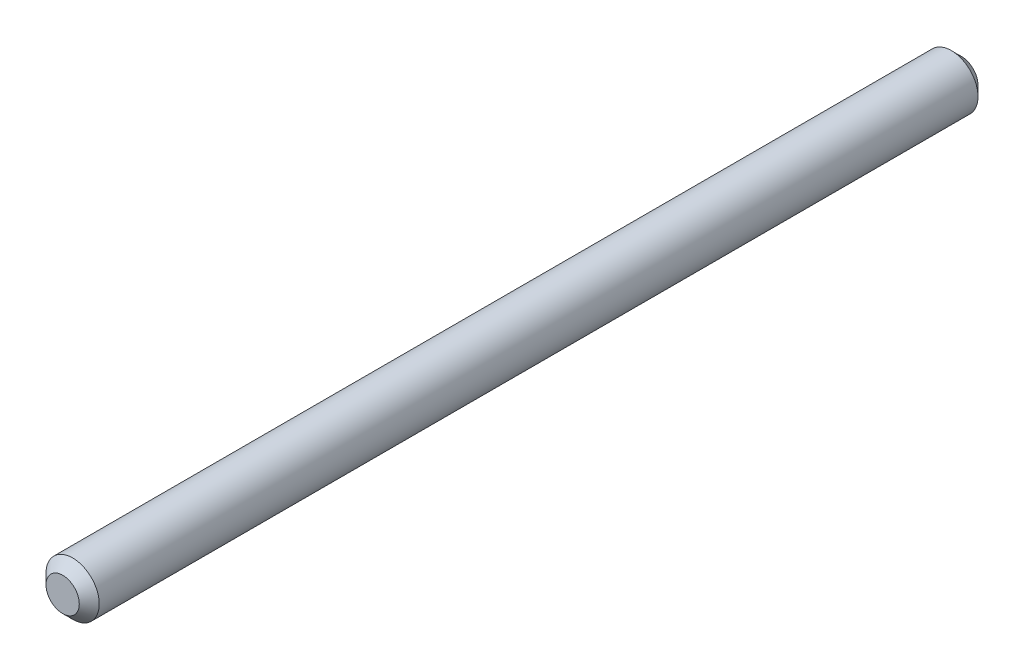
ISO-10303-21;
HEADER;
FILE_DESCRIPTION(('STEP AP214'),'2;1');
FILE_NAME('part.step','',(''),(''),'','','');
FILE_SCHEMA(('AUTOMOTIVE_DESIGN { 1 0 10303 214 1 1 1 1 }'));
ENDSEC;
DATA;
#1=APPLICATION_CONTEXT('core data for automotive mechanical design processes');
#2=APPLICATION_PROTOCOL_DEFINITION('international standard','automotive_design',2000,#1);
#3=PRODUCT_CONTEXT('',#1,'mechanical');
#4=PRODUCT('Part','Part','',(#3));
#5=PRODUCT_RELATED_PRODUCT_CATEGORY('part','',(#4));
#6=PRODUCT_DEFINITION_FORMATION('','',#4);
#7=PRODUCT_DEFINITION_CONTEXT('part definition',#1,'design');
#8=PRODUCT_DEFINITION('design','',#6,#7);
#9=PRODUCT_DEFINITION_SHAPE('','',#8);
#10=(LENGTH_UNIT() NAMED_UNIT(*) SI_UNIT(.MILLI.,.METRE.));
#11=(NAMED_UNIT(*) PLANE_ANGLE_UNIT() SI_UNIT($,.RADIAN.));
#12=(NAMED_UNIT(*) SI_UNIT($,.STERADIAN.) SOLID_ANGLE_UNIT());
#13=UNCERTAINTY_MEASURE_WITH_UNIT(LENGTH_MEASURE(1.E-05),#10,'distance_accuracy_value','');
#14=(GEOMETRIC_REPRESENTATION_CONTEXT(3) GLOBAL_UNCERTAINTY_ASSIGNED_CONTEXT((#13)) GLOBAL_UNIT_ASSIGNED_CONTEXT((#10,
#11,#12)) REPRESENTATION_CONTEXT('',''));
#15=CARTESIAN_POINT('',(0.,0.,0.));
#16=DIRECTION('',(0.,0.,1.));
#17=DIRECTION('',(1.,0.,0.));
#18=AXIS2_PLACEMENT_3D('',#15,#16,#17);
#19=CARTESIAN_POINT('',(0.,0.,33.75));
#20=DIRECTION('',(0.,0.,-1.));
#21=DIRECTION('',(-1.,0.,0.));
#22=AXIS2_PLACEMENT_3D('',#19,#20,#21);
#23=CYLINDRICAL_SURFACE('',#22,1.);
#24=CARTESIAN_POINT('',(0.,0.,33.375));
#25=DIRECTION('',(0.,0.,1.));
#26=DIRECTION('',(1.,0.,0.));
#27=AXIS2_PLACEMENT_3D('',#24,#25,#26);
#28=CIRCLE('',#27,1.);
#29=CARTESIAN_POINT('',(1.,0.,33.375));
#30=VERTEX_POINT('',#29);
#31=EDGE_CURVE('E54',#30,#30,#28,.F.);
#32=ORIENTED_EDGE('',*,*,#31,.T.);
#33=EDGE_LOOP('',(#32));
#34=FACE_BOUND('',#33,.T.);
#35=CARTESIAN_POINT('',(0.,0.,0.375000000000007));
#36=DIRECTION('',(0.,0.,1.));
#37=DIRECTION('',(1.,0.,0.));
#38=AXIS2_PLACEMENT_3D('',#35,#36,#37);
#39=CIRCLE('',#38,1.);
#40=CARTESIAN_POINT('',(1.,0.,0.375000000000007));
#41=VERTEX_POINT('',#40);
#42=EDGE_CURVE('E59',#41,#41,#39,.T.);
#43=ORIENTED_EDGE('',*,*,#42,.T.);
#44=EDGE_LOOP('',(#43));
#45=FACE_BOUND('',#44,.T.);
#46=ADVANCED_FACE('F45',(#34,#45),#23,.T.);
#47=CARTESIAN_POINT('',(0.,0.,33.75));
#48=DIRECTION('',(0.,0.,1.));
#49=DIRECTION('',(1.,0.,0.));
#50=AXIS2_PLACEMENT_3D('',#47,#48,#49);
#51=PLANE('',#50);
#52=CARTESIAN_POINT('',(0.,0.,33.75));
#53=DIRECTION('',(0.,0.,1.));
#54=DIRECTION('',(1.,0.,0.));
#55=AXIS2_PLACEMENT_3D('',#52,#53,#54);
#56=CIRCLE('',#55,0.624999999999997);
#57=CARTESIAN_POINT('',(0.624999999999997,0.,33.75));
#58=VERTEX_POINT('',#57);
#59=EDGE_CURVE('E64',#58,#58,#56,.T.);
#60=ORIENTED_EDGE('',*,*,#59,.T.);
#61=EDGE_LOOP('',(#60));
#62=FACE_BOUND('',#61,.T.);
#63=ADVANCED_FACE('F71',(#62),#51,.T.);
#64=CARTESIAN_POINT('',(0.,0.,0.));
#65=DIRECTION('',(0.,0.,1.));
#66=DIRECTION('',(1.,0.,0.));
#67=AXIS2_PLACEMENT_3D('',#64,#65,#66);
#68=PLANE('',#67);
#69=CARTESIAN_POINT('',(0.,0.,0.));
#70=DIRECTION('',(0.,0.,1.));
#71=DIRECTION('',(1.,0.,0.));
#72=AXIS2_PLACEMENT_3D('',#69,#70,#71);
#73=CIRCLE('',#72,0.624999999999994);
#74=CARTESIAN_POINT('',(0.624999999999994,0.,0.));
#75=VERTEX_POINT('',#74);
#76=EDGE_CURVE('E10',#75,#75,#73,.F.);
#77=ORIENTED_EDGE('',*,*,#76,.T.);
#78=EDGE_LOOP('',(#77));
#79=FACE_BOUND('',#78,.T.);
#80=ADVANCED_FACE('F75',(#79),#68,.F.);
#81=CARTESIAN_POINT('',(0.,0.,33.75));
#82=DIRECTION('',(0.,0.,-1.));
#83=DIRECTION('',(-1.,0.,0.));
#84=AXIS2_PLACEMENT_3D('',#81,#82,#83);
#85=CONICAL_SURFACE('',#84,0.624999999999997,0.785398163397452);
#86=ORIENTED_EDGE('',*,*,#31,.F.);
#87=EDGE_LOOP('',(#86));
#88=FACE_BOUND('',#87,.T.);
#89=ORIENTED_EDGE('',*,*,#59,.F.);
#90=EDGE_LOOP('',(#89));
#91=FACE_BOUND('',#90,.T.);
#92=ADVANCED_FACE('F73',(#88,#91),#85,.T.);
#93=CARTESIAN_POINT('',(0.,0.,0.375000000000007));
#94=DIRECTION('',(0.,0.,1.));
#95=DIRECTION('',(1.,0.,0.));
#96=AXIS2_PLACEMENT_3D('',#93,#94,#95);
#97=CONICAL_SURFACE('',#96,1.,0.785398163397447);
#98=ORIENTED_EDGE('',*,*,#76,.F.);
#99=EDGE_LOOP('',(#98));
#100=FACE_BOUND('',#99,.T.);
#101=ORIENTED_EDGE('',*,*,#42,.F.);
#102=EDGE_LOOP('',(#101));
#103=FACE_BOUND('',#102,.T.);
#104=ADVANCED_FACE('F48',(#100,#103),#97,.T.);
#105=CLOSED_SHELL('',(#46,#63,#80,#92,#104));
#106=MANIFOLD_SOLID_BREP('B2',#105);
#107=ADVANCED_BREP_SHAPE_REPRESENTATION('',(#18,#106),#14);
#108=SHAPE_DEFINITION_REPRESENTATION(#9,#107);
ENDSEC;
END-ISO-10303-21;
